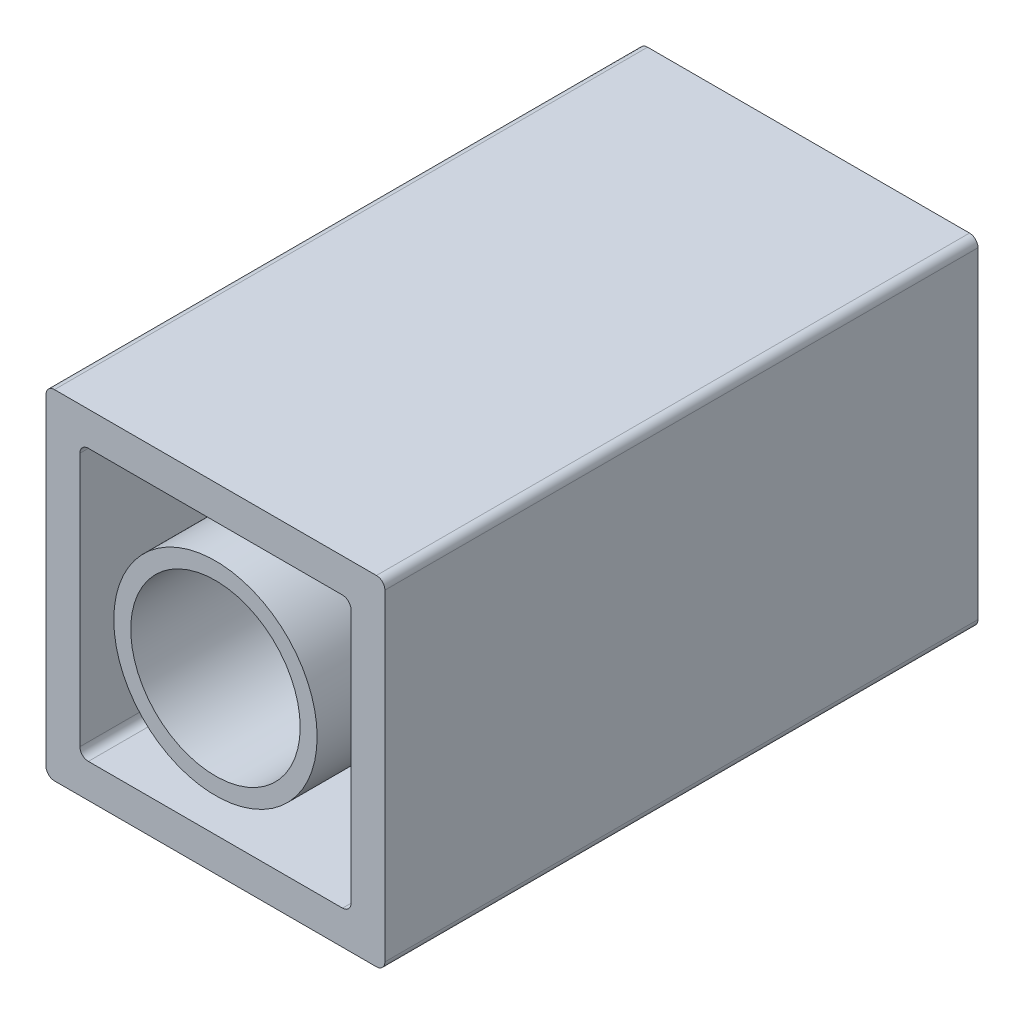
ISO-10303-21;
HEADER;
FILE_DESCRIPTION(('STEP AP214'),'2;1');
FILE_NAME('part.step','',(''),(''),'','','');
FILE_SCHEMA(('AUTOMOTIVE_DESIGN { 1 0 10303 214 1 1 1 1 }'));
ENDSEC;
DATA;
#1=APPLICATION_CONTEXT('core data for automotive mechanical design processes');
#2=APPLICATION_PROTOCOL_DEFINITION('international standard','automotive_design',2000,#1);
#3=PRODUCT_CONTEXT('',#1,'mechanical');
#4=PRODUCT('Part','Part','',(#3));
#5=PRODUCT_RELATED_PRODUCT_CATEGORY('part','',(#4));
#6=PRODUCT_DEFINITION_FORMATION('','',#4);
#7=PRODUCT_DEFINITION_CONTEXT('part definition',#1,'design');
#8=PRODUCT_DEFINITION('design','',#6,#7);
#9=PRODUCT_DEFINITION_SHAPE('','',#8);
#10=(LENGTH_UNIT() NAMED_UNIT(*) SI_UNIT(.MILLI.,.METRE.));
#11=(NAMED_UNIT(*) PLANE_ANGLE_UNIT() SI_UNIT($,.RADIAN.));
#12=(NAMED_UNIT(*) SI_UNIT($,.STERADIAN.) SOLID_ANGLE_UNIT());
#13=UNCERTAINTY_MEASURE_WITH_UNIT(LENGTH_MEASURE(1.E-05),#10,'distance_accuracy_value','');
#14=(GEOMETRIC_REPRESENTATION_CONTEXT(3) GLOBAL_UNCERTAINTY_ASSIGNED_CONTEXT((#13)) GLOBAL_UNIT_ASSIGNED_CONTEXT((#10,
#11,#12)) REPRESENTATION_CONTEXT('',''));
#15=CARTESIAN_POINT('',(0.,0.,0.));
#16=DIRECTION('',(0.,0.,1.));
#17=DIRECTION('',(1.,0.,0.));
#18=AXIS2_PLACEMENT_3D('',#15,#16,#17);
#19=CARTESIAN_POINT('',(-10.,10.,35.));
#20=DIRECTION('',(1.,0.,0.));
#21=DIRECTION('',(0.,1.,0.));
#22=AXIS2_PLACEMENT_3D('',#19,#20,#21);
#23=PLANE('',#22);
#24=DIRECTION('',(0.,-1.,0.));
#25=VECTOR('',#24,1.);
#26=CARTESIAN_POINT('',(-10.,10.,0.));
#27=LINE('',#26,#25);
#28=CARTESIAN_POINT('',(-10.,9.5,0.));
#29=VERTEX_POINT('',#28);
#30=CARTESIAN_POINT('',(-10.,-9.5,0.));
#31=VERTEX_POINT('',#30);
#32=EDGE_CURVE('E324',#29,#31,#27,.T.);
#33=ORIENTED_EDGE('',*,*,#32,.T.);
#34=DIRECTION('',(0.,0.,-1.));
#35=VECTOR('',#34,1.);
#36=CARTESIAN_POINT('',(-10.,-9.5,35.));
#37=LINE('',#36,#35);
#38=CARTESIAN_POINT('',(-10.,-9.5,35.));
#39=VERTEX_POINT('',#38);
#40=EDGE_CURVE('E220',#31,#39,#37,.F.);
#41=ORIENTED_EDGE('',*,*,#40,.T.);
#42=DIRECTION('',(0.,-1.,0.));
#43=VECTOR('',#42,1.);
#44=CARTESIAN_POINT('',(-10.,10.,35.));
#45=LINE('',#44,#43);
#46=CARTESIAN_POINT('',(-10.,9.5,35.));
#47=VERTEX_POINT('',#46);
#48=EDGE_CURVE('E316',#47,#39,#45,.T.);
#49=ORIENTED_EDGE('',*,*,#48,.F.);
#50=DIRECTION('',(0.,0.,-1.));
#51=VECTOR('',#50,1.);
#52=CARTESIAN_POINT('',(-10.,9.5,35.));
#53=LINE('',#52,#51);
#54=EDGE_CURVE('E217',#47,#29,#53,.T.);
#55=ORIENTED_EDGE('',*,*,#54,.T.);
#56=EDGE_LOOP('',(#33,#41,#49,#55));
#57=FACE_BOUND('',#56,.T.);
#58=ADVANCED_FACE('F36',(#57),#23,.F.);
#59=CARTESIAN_POINT('',(-10.,-10.,35.));
#60=DIRECTION('',(0.,1.,0.));
#61=DIRECTION('',(0.,0.,1.));
#62=AXIS2_PLACEMENT_3D('',#59,#60,#61);
#63=PLANE('',#62);
#64=DIRECTION('',(1.,0.,0.));
#65=VECTOR('',#64,1.);
#66=CARTESIAN_POINT('',(-10.,-10.,35.));
#67=LINE('',#66,#65);
#68=CARTESIAN_POINT('',(-9.5,-10.,35.));
#69=VERTEX_POINT('',#68);
#70=CARTESIAN_POINT('',(9.5,-10.,35.));
#71=VERTEX_POINT('',#70);
#72=EDGE_CURVE('E319',#69,#71,#67,.T.);
#73=ORIENTED_EDGE('',*,*,#72,.F.);
#74=DIRECTION('',(0.,0.,-1.));
#75=VECTOR('',#74,1.);
#76=CARTESIAN_POINT('',(-9.5,-10.,35.));
#77=LINE('',#76,#75);
#78=CARTESIAN_POINT('',(-9.5,-10.,0.));
#79=VERTEX_POINT('',#78);
#80=EDGE_CURVE('E206',#69,#79,#77,.T.);
#81=ORIENTED_EDGE('',*,*,#80,.T.);
#82=DIRECTION('',(1.,0.,0.));
#83=VECTOR('',#82,1.);
#84=CARTESIAN_POINT('',(-10.,-10.,0.));
#85=LINE('',#84,#83);
#86=CARTESIAN_POINT('',(9.5,-10.,0.));
#87=VERTEX_POINT('',#86);
#88=EDGE_CURVE('E321',#79,#87,#85,.T.);
#89=ORIENTED_EDGE('',*,*,#88,.T.);
#90=DIRECTION('',(0.,0.,-1.));
#91=VECTOR('',#90,1.);
#92=CARTESIAN_POINT('',(9.5,-10.,35.));
#93=LINE('',#92,#91);
#94=EDGE_CURVE('E204',#87,#71,#93,.F.);
#95=ORIENTED_EDGE('',*,*,#94,.T.);
#96=EDGE_LOOP('',(#73,#81,#89,#95));
#97=FACE_BOUND('',#96,.T.);
#98=ADVANCED_FACE('F261',(#97),#63,.F.);
#99=CARTESIAN_POINT('',(10.,10.,35.));
#100=DIRECTION('',(-1.,0.,0.));
#101=DIRECTION('',(0.,-1.,0.));
#102=AXIS2_PLACEMENT_3D('',#99,#100,#101);
#103=PLANE('',#102);
#104=DIRECTION('',(0.,1.,0.));
#105=VECTOR('',#104,1.);
#106=CARTESIAN_POINT('',(10.,10.,35.));
#107=LINE('',#106,#105);
#108=CARTESIAN_POINT('',(10.,-9.5,35.));
#109=VERTEX_POINT('',#108);
#110=CARTESIAN_POINT('',(10.,9.5,35.));
#111=VERTEX_POINT('',#110);
#112=EDGE_CURVE('E181',#109,#111,#107,.T.);
#113=ORIENTED_EDGE('',*,*,#112,.F.);
#114=DIRECTION('',(0.,0.,-1.));
#115=VECTOR('',#114,1.);
#116=CARTESIAN_POINT('',(10.,-9.5,35.));
#117=LINE('',#116,#115);
#118=CARTESIAN_POINT('',(10.,-9.5,0.));
#119=VERTEX_POINT('',#118);
#120=EDGE_CURVE('E231',#109,#119,#117,.T.);
#121=ORIENTED_EDGE('',*,*,#120,.T.);
#122=DIRECTION('',(0.,1.,0.));
#123=VECTOR('',#122,1.);
#124=CARTESIAN_POINT('',(10.,10.,0.));
#125=LINE('',#124,#123);
#126=CARTESIAN_POINT('',(10.,9.5,0.));
#127=VERTEX_POINT('',#126);
#128=EDGE_CURVE('E317',#119,#127,#125,.T.);
#129=ORIENTED_EDGE('',*,*,#128,.T.);
#130=DIRECTION('',(0.,0.,-1.));
#131=VECTOR('',#130,1.);
#132=CARTESIAN_POINT('',(10.,9.5,35.));
#133=LINE('',#132,#131);
#134=EDGE_CURVE('E229',#127,#111,#133,.F.);
#135=ORIENTED_EDGE('',*,*,#134,.T.);
#136=EDGE_LOOP('',(#113,#121,#129,#135));
#137=FACE_BOUND('',#136,.T.);
#138=ADVANCED_FACE('F267',(#137),#103,.F.);
#139=CARTESIAN_POINT('',(-10.,10.,35.));
#140=DIRECTION('',(0.,-1.,0.));
#141=DIRECTION('',(0.,0.,-1.));
#142=AXIS2_PLACEMENT_3D('',#139,#140,#141);
#143=PLANE('',#142);
#144=DIRECTION('',(-1.,0.,0.));
#145=VECTOR('',#144,1.);
#146=CARTESIAN_POINT('',(-10.,10.,0.));
#147=LINE('',#146,#145);
#148=CARTESIAN_POINT('',(9.5,10.,0.));
#149=VERTEX_POINT('',#148);
#150=CARTESIAN_POINT('',(-9.5,10.,0.));
#151=VERTEX_POINT('',#150);
#152=EDGE_CURVE('E184',#149,#151,#147,.T.);
#153=ORIENTED_EDGE('',*,*,#152,.T.);
#154=DIRECTION('',(0.,0.,-1.));
#155=VECTOR('',#154,1.);
#156=CARTESIAN_POINT('',(-9.5,10.,35.));
#157=LINE('',#156,#155);
#158=CARTESIAN_POINT('',(-9.5,10.,35.));
#159=VERTEX_POINT('',#158);
#160=EDGE_CURVE('E51',#151,#159,#157,.F.);
#161=ORIENTED_EDGE('',*,*,#160,.T.);
#162=DIRECTION('',(-1.,0.,0.));
#163=VECTOR('',#162,1.);
#164=CARTESIAN_POINT('',(-10.,10.,35.));
#165=LINE('',#164,#163);
#166=CARTESIAN_POINT('',(9.5,10.,35.));
#167=VERTEX_POINT('',#166);
#168=EDGE_CURVE('E177',#167,#159,#165,.T.);
#169=ORIENTED_EDGE('',*,*,#168,.F.);
#170=DIRECTION('',(0.,0.,-1.));
#171=VECTOR('',#170,1.);
#172=CARTESIAN_POINT('',(9.5,10.,35.));
#173=LINE('',#172,#171);
#174=EDGE_CURVE('E234',#167,#149,#173,.T.);
#175=ORIENTED_EDGE('',*,*,#174,.T.);
#176=EDGE_LOOP('',(#153,#161,#169,#175));
#177=FACE_BOUND('',#176,.T.);
#178=ADVANCED_FACE('F309',(#177),#143,.F.);
#179=CARTESIAN_POINT('',(0.,0.,35.));
#180=DIRECTION('',(0.,0.,1.));
#181=DIRECTION('',(1.,0.,0.));
#182=AXIS2_PLACEMENT_3D('',#179,#180,#181);
#183=PLANE('',#182);
#184=DIRECTION('',(0.,-1.,0.));
#185=VECTOR('',#184,1.);
#186=CARTESIAN_POINT('',(-8.,10.,35.));
#187=LINE('',#186,#185);
#188=CARTESIAN_POINT('',(-8.,7.5,35.));
#189=VERTEX_POINT('',#188);
#190=CARTESIAN_POINT('',(-8.,-7.5,35.));
#191=VERTEX_POINT('',#190);
#192=EDGE_CURVE('E339',#189,#191,#187,.T.);
#193=ORIENTED_EDGE('',*,*,#192,.F.);
#194=CARTESIAN_POINT('',(-7.5,7.5,35.));
#195=DIRECTION('',(0.,0.,1.));
#196=DIRECTION('',(1.,0.,0.));
#197=AXIS2_PLACEMENT_3D('',#194,#195,#196);
#198=CIRCLE('',#197,0.5);
#199=CARTESIAN_POINT('',(-7.5,8.,35.));
#200=VERTEX_POINT('',#199);
#201=EDGE_CURVE('E243',#189,#200,#198,.F.);
#202=ORIENTED_EDGE('',*,*,#201,.T.);
#203=DIRECTION('',(-1.,0.,0.));
#204=VECTOR('',#203,1.);
#205=CARTESIAN_POINT('',(-10.,8.,35.));
#206=LINE('',#205,#204);
#207=CARTESIAN_POINT('',(7.5,8.,35.));
#208=VERTEX_POINT('',#207);
#209=EDGE_CURVE('E327',#208,#200,#206,.T.);
#210=ORIENTED_EDGE('',*,*,#209,.F.);
#211=CARTESIAN_POINT('',(7.5,7.5,35.));
#212=DIRECTION('',(0.,0.,1.));
#213=DIRECTION('',(1.,0.,0.));
#214=AXIS2_PLACEMENT_3D('',#211,#212,#213);
#215=CIRCLE('',#214,0.5);
#216=CARTESIAN_POINT('',(8.,7.5,35.));
#217=VERTEX_POINT('',#216);
#218=EDGE_CURVE('E238',#208,#217,#215,.F.);
#219=ORIENTED_EDGE('',*,*,#218,.T.);
#220=DIRECTION('',(0.,1.,0.));
#221=VECTOR('',#220,1.);
#222=CARTESIAN_POINT('',(8.,10.,35.));
#223=LINE('',#222,#221);
#224=CARTESIAN_POINT('',(8.,-7.5,35.));
#225=VERTEX_POINT('',#224);
#226=EDGE_CURVE('E334',#225,#217,#223,.T.);
#227=ORIENTED_EDGE('',*,*,#226,.F.);
#228=CARTESIAN_POINT('',(7.5,-7.5,35.));
#229=DIRECTION('',(0.,0.,1.));
#230=DIRECTION('',(1.,0.,0.));
#231=AXIS2_PLACEMENT_3D('',#228,#229,#230);
#232=CIRCLE('',#231,0.5);
#233=CARTESIAN_POINT('',(7.5,-8.,35.));
#234=VERTEX_POINT('',#233);
#235=EDGE_CURVE('E176',#225,#234,#232,.F.);
#236=ORIENTED_EDGE('',*,*,#235,.T.);
#237=DIRECTION('',(1.,0.,0.));
#238=VECTOR('',#237,1.);
#239=CARTESIAN_POINT('',(-10.,-8.,35.));
#240=LINE('',#239,#238);
#241=CARTESIAN_POINT('',(-7.5,-8.,35.));
#242=VERTEX_POINT('',#241);
#243=EDGE_CURVE('E336',#242,#234,#240,.T.);
#244=ORIENTED_EDGE('',*,*,#243,.F.);
#245=CARTESIAN_POINT('',(-7.5,-7.5,35.));
#246=DIRECTION('',(0.,0.,1.));
#247=DIRECTION('',(1.,0.,0.));
#248=AXIS2_PLACEMENT_3D('',#245,#246,#247);
#249=CIRCLE('',#248,0.5);
#250=EDGE_CURVE('E241',#242,#191,#249,.F.);
#251=ORIENTED_EDGE('',*,*,#250,.T.);
#252=EDGE_LOOP('',(#193,#202,#210,#219,#227,#236,#244,#251));
#253=FACE_BOUND('',#252,.T.);
#254=ORIENTED_EDGE('',*,*,#48,.T.);
#255=CARTESIAN_POINT('',(-9.5,-9.5,35.));
#256=DIRECTION('',(0.,0.,1.));
#257=DIRECTION('',(1.,0.,0.));
#258=AXIS2_PLACEMENT_3D('',#255,#256,#257);
#259=CIRCLE('',#258,0.5);
#260=EDGE_CURVE('E227',#39,#69,#259,.T.);
#261=ORIENTED_EDGE('',*,*,#260,.T.);
#262=ORIENTED_EDGE('',*,*,#72,.T.);
#263=CARTESIAN_POINT('',(9.5,-9.5,35.));
#264=DIRECTION('',(0.,0.,1.));
#265=DIRECTION('',(1.,0.,0.));
#266=AXIS2_PLACEMENT_3D('',#263,#264,#265);
#267=CIRCLE('',#266,0.5);
#268=EDGE_CURVE('E225',#71,#109,#267,.T.);
#269=ORIENTED_EDGE('',*,*,#268,.T.);
#270=ORIENTED_EDGE('',*,*,#112,.T.);
#271=CARTESIAN_POINT('',(9.5,9.5,35.));
#272=DIRECTION('',(0.,0.,1.));
#273=DIRECTION('',(1.,0.,0.));
#274=AXIS2_PLACEMENT_3D('',#271,#272,#273);
#275=CIRCLE('',#274,0.5);
#276=EDGE_CURVE('E58',#111,#167,#275,.T.);
#277=ORIENTED_EDGE('',*,*,#276,.T.);
#278=ORIENTED_EDGE('',*,*,#168,.T.);
#279=CARTESIAN_POINT('',(-9.5,9.5,35.));
#280=DIRECTION('',(0.,0.,1.));
#281=DIRECTION('',(1.,0.,0.));
#282=AXIS2_PLACEMENT_3D('',#279,#280,#281);
#283=CIRCLE('',#282,0.5);
#284=EDGE_CURVE('E223',#159,#47,#283,.T.);
#285=ORIENTED_EDGE('',*,*,#284,.T.);
#286=EDGE_LOOP('',(#254,#261,#262,#269,#270,#277,#278,#285));
#287=FACE_BOUND('',#286,.T.);
#288=ADVANCED_FACE('F386',(#253,#287),#183,.T.);
#289=CARTESIAN_POINT('',(0.,0.,0.));
#290=DIRECTION('',(0.,0.,1.));
#291=DIRECTION('',(1.,0.,0.));
#292=AXIS2_PLACEMENT_3D('',#289,#290,#291);
#293=PLANE('',#292);
#294=ORIENTED_EDGE('',*,*,#88,.F.);
#295=CARTESIAN_POINT('',(-9.5,-9.5,0.));
#296=DIRECTION('',(0.,0.,1.));
#297=DIRECTION('',(1.,0.,0.));
#298=AXIS2_PLACEMENT_3D('',#295,#296,#297);
#299=CIRCLE('',#298,0.5);
#300=EDGE_CURVE('E215',#79,#31,#299,.F.);
#301=ORIENTED_EDGE('',*,*,#300,.T.);
#302=ORIENTED_EDGE('',*,*,#32,.F.);
#303=CARTESIAN_POINT('',(-9.5,9.5,0.));
#304=DIRECTION('',(0.,0.,1.));
#305=DIRECTION('',(1.,0.,0.));
#306=AXIS2_PLACEMENT_3D('',#303,#304,#305);
#307=CIRCLE('',#306,0.5);
#308=EDGE_CURVE('E211',#29,#151,#307,.F.);
#309=ORIENTED_EDGE('',*,*,#308,.T.);
#310=ORIENTED_EDGE('',*,*,#152,.F.);
#311=CARTESIAN_POINT('',(9.5,9.5,0.));
#312=DIRECTION('',(0.,0.,1.));
#313=DIRECTION('',(1.,0.,0.));
#314=AXIS2_PLACEMENT_3D('',#311,#312,#313);
#315=CIRCLE('',#314,0.5);
#316=EDGE_CURVE('E209',#149,#127,#315,.F.);
#317=ORIENTED_EDGE('',*,*,#316,.T.);
#318=ORIENTED_EDGE('',*,*,#128,.F.);
#319=CARTESIAN_POINT('',(9.5,-9.5,0.));
#320=DIRECTION('',(0.,0.,1.));
#321=DIRECTION('',(1.,0.,0.));
#322=AXIS2_PLACEMENT_3D('',#319,#320,#321);
#323=CIRCLE('',#322,0.5);
#324=EDGE_CURVE('E213',#119,#87,#323,.F.);
#325=ORIENTED_EDGE('',*,*,#324,.T.);
#326=EDGE_LOOP('',(#294,#301,#302,#309,#310,#317,#318,#325));
#327=FACE_BOUND('',#326,.T.);
#328=ADVANCED_FACE('F312',(#327),#293,.F.);
#329=CARTESIAN_POINT('',(-8.,10.,35.));
#330=DIRECTION('',(1.,0.,0.));
#331=DIRECTION('',(0.,1.,0.));
#332=AXIS2_PLACEMENT_3D('',#329,#330,#331);
#333=PLANE('',#332);
#334=ORIENTED_EDGE('',*,*,#192,.T.);
#335=DIRECTION('',(0.,0.,-1.));
#336=VECTOR('',#335,1.);
#337=CARTESIAN_POINT('',(-8.,-7.5,2.));
#338=LINE('',#337,#336);
#339=CARTESIAN_POINT('',(-8.,-7.5,2.));
#340=VERTEX_POINT('',#339);
#341=EDGE_CURVE('E201',#191,#340,#338,.T.);
#342=ORIENTED_EDGE('',*,*,#341,.T.);
#343=DIRECTION('',(0.,-1.,0.));
#344=VECTOR('',#343,1.);
#345=CARTESIAN_POINT('',(-8.,10.,2.));
#346=LINE('',#345,#344);
#347=CARTESIAN_POINT('',(-8.,7.5,2.));
#348=VERTEX_POINT('',#347);
#349=EDGE_CURVE('E345',#348,#340,#346,.T.);
#350=ORIENTED_EDGE('',*,*,#349,.F.);
#351=DIRECTION('',(0.,0.,-1.));
#352=VECTOR('',#351,1.);
#353=CARTESIAN_POINT('',(-8.,7.5,35.));
#354=LINE('',#353,#352);
#355=EDGE_CURVE('E199',#348,#189,#354,.F.);
#356=ORIENTED_EDGE('',*,*,#355,.T.);
#357=EDGE_LOOP('',(#334,#342,#350,#356));
#358=FACE_BOUND('',#357,.T.);
#359=ADVANCED_FACE('F369',(#358),#333,.T.);
#360=CARTESIAN_POINT('',(-10.,-8.,35.));
#361=DIRECTION('',(0.,1.,0.));
#362=DIRECTION('',(0.,0.,1.));
#363=AXIS2_PLACEMENT_3D('',#360,#361,#362);
#364=PLANE('',#363);
#365=ORIENTED_EDGE('',*,*,#243,.T.);
#366=DIRECTION('',(0.,0.,-1.));
#367=VECTOR('',#366,1.);
#368=CARTESIAN_POINT('',(7.5,-8.,2.));
#369=LINE('',#368,#367);
#370=CARTESIAN_POINT('',(7.5,-8.,2.));
#371=VERTEX_POINT('',#370);
#372=EDGE_CURVE('E197',#234,#371,#369,.T.);
#373=ORIENTED_EDGE('',*,*,#372,.T.);
#374=DIRECTION('',(1.,0.,0.));
#375=VECTOR('',#374,1.);
#376=CARTESIAN_POINT('',(-10.,-8.,2.));
#377=LINE('',#376,#375);
#378=CARTESIAN_POINT('',(-7.5,-8.,2.));
#379=VERTEX_POINT('',#378);
#380=EDGE_CURVE('E156',#379,#371,#377,.T.);
#381=ORIENTED_EDGE('',*,*,#380,.F.);
#382=DIRECTION('',(0.,0.,-1.));
#383=VECTOR('',#382,1.);
#384=CARTESIAN_POINT('',(-7.5,-8.,35.));
#385=LINE('',#384,#383);
#386=EDGE_CURVE('E195',#379,#242,#385,.F.);
#387=ORIENTED_EDGE('',*,*,#386,.T.);
#388=EDGE_LOOP('',(#365,#373,#381,#387));
#389=FACE_BOUND('',#388,.T.);
#390=ADVANCED_FACE('F372',(#389),#364,.T.);
#391=CARTESIAN_POINT('',(8.,10.,35.));
#392=DIRECTION('',(-1.,0.,0.));
#393=DIRECTION('',(0.,-1.,0.));
#394=AXIS2_PLACEMENT_3D('',#391,#392,#393);
#395=PLANE('',#394);
#396=ORIENTED_EDGE('',*,*,#226,.T.);
#397=DIRECTION('',(0.,0.,-1.));
#398=VECTOR('',#397,1.);
#399=CARTESIAN_POINT('',(8.,7.5,2.));
#400=LINE('',#399,#398);
#401=CARTESIAN_POINT('',(8.,7.5,2.));
#402=VERTEX_POINT('',#401);
#403=EDGE_CURVE('E171',#217,#402,#400,.T.);
#404=ORIENTED_EDGE('',*,*,#403,.T.);
#405=DIRECTION('',(0.,1.,0.));
#406=VECTOR('',#405,1.);
#407=CARTESIAN_POINT('',(8.,10.,2.));
#408=LINE('',#407,#406);
#409=CARTESIAN_POINT('',(8.,-7.5,2.));
#410=VERTEX_POINT('',#409);
#411=EDGE_CURVE('E154',#410,#402,#408,.T.);
#412=ORIENTED_EDGE('',*,*,#411,.F.);
#413=DIRECTION('',(0.,0.,-1.));
#414=VECTOR('',#413,1.);
#415=CARTESIAN_POINT('',(8.,-7.5,35.));
#416=LINE('',#415,#414);
#417=EDGE_CURVE('E168',#410,#225,#416,.F.);
#418=ORIENTED_EDGE('',*,*,#417,.T.);
#419=EDGE_LOOP('',(#396,#404,#412,#418));
#420=FACE_BOUND('',#419,.T.);
#421=ADVANCED_FACE('F167',(#420),#395,.T.);
#422=CARTESIAN_POINT('',(-10.,8.,35.));
#423=DIRECTION('',(0.,-1.,0.));
#424=DIRECTION('',(0.,0.,-1.));
#425=AXIS2_PLACEMENT_3D('',#422,#423,#424);
#426=PLANE('',#425);
#427=DIRECTION('',(-1.,0.,0.));
#428=VECTOR('',#427,1.);
#429=CARTESIAN_POINT('',(-10.,8.,2.));
#430=LINE('',#429,#428);
#431=CARTESIAN_POINT('',(7.5,8.,2.));
#432=VERTEX_POINT('',#431);
#433=CARTESIAN_POINT('',(-7.5,8.,2.));
#434=VERTEX_POINT('',#433);
#435=EDGE_CURVE('E172',#432,#434,#430,.T.);
#436=ORIENTED_EDGE('',*,*,#435,.F.);
#437=DIRECTION('',(0.,0.,-1.));
#438=VECTOR('',#437,1.);
#439=CARTESIAN_POINT('',(7.5,8.,35.));
#440=LINE('',#439,#438);
#441=EDGE_CURVE('E193',#432,#208,#440,.F.);
#442=ORIENTED_EDGE('',*,*,#441,.T.);
#443=ORIENTED_EDGE('',*,*,#209,.T.);
#444=DIRECTION('',(0.,0.,-1.));
#445=VECTOR('',#444,1.);
#446=CARTESIAN_POINT('',(-7.5,8.,2.));
#447=LINE('',#446,#445);
#448=EDGE_CURVE('E190',#200,#434,#447,.T.);
#449=ORIENTED_EDGE('',*,*,#448,.T.);
#450=EDGE_LOOP('',(#436,#442,#443,#449));
#451=FACE_BOUND('',#450,.T.);
#452=ADVANCED_FACE('F379',(#451),#426,.T.);
#453=CARTESIAN_POINT('',(0.,0.,2.));
#454=DIRECTION('',(0.,0.,1.));
#455=DIRECTION('',(1.,0.,0.));
#456=AXIS2_PLACEMENT_3D('',#453,#454,#455);
#457=PLANE('',#456);
#458=CARTESIAN_POINT('',(0.,0.,2.));
#459=DIRECTION('',(0.,0.,1.));
#460=DIRECTION('',(1.,0.,0.));
#461=AXIS2_PLACEMENT_3D('',#458,#459,#460);
#462=CIRCLE('',#461,6.8);
#463=CARTESIAN_POINT('',(6.8,0.,2.));
#464=VERTEX_POINT('',#463);
#465=EDGE_CURVE('E11',#464,#464,#462,.F.);
#466=ORIENTED_EDGE('',*,*,#465,.T.);
#467=EDGE_LOOP('',(#466));
#468=FACE_BOUND('',#467,.T.);
#469=ORIENTED_EDGE('',*,*,#411,.T.);
#470=CARTESIAN_POINT('',(7.5,7.5,2.));
#471=DIRECTION('',(0.,0.,1.));
#472=DIRECTION('',(1.,0.,0.));
#473=AXIS2_PLACEMENT_3D('',#470,#471,#472);
#474=CIRCLE('',#473,0.5);
#475=EDGE_CURVE('E161',#402,#432,#474,.T.);
#476=ORIENTED_EDGE('',*,*,#475,.T.);
#477=ORIENTED_EDGE('',*,*,#435,.T.);
#478=CARTESIAN_POINT('',(-7.5,7.5,2.));
#479=DIRECTION('',(0.,0.,1.));
#480=DIRECTION('',(1.,0.,0.));
#481=AXIS2_PLACEMENT_3D('',#478,#479,#480);
#482=CIRCLE('',#481,0.5);
#483=EDGE_CURVE('E179',#434,#348,#482,.T.);
#484=ORIENTED_EDGE('',*,*,#483,.T.);
#485=ORIENTED_EDGE('',*,*,#349,.T.);
#486=CARTESIAN_POINT('',(-7.5,-7.5,2.));
#487=DIRECTION('',(0.,0.,1.));
#488=DIRECTION('',(1.,0.,0.));
#489=AXIS2_PLACEMENT_3D('',#486,#487,#488);
#490=CIRCLE('',#489,0.5);
#491=EDGE_CURVE('E162',#340,#379,#490,.T.);
#492=ORIENTED_EDGE('',*,*,#491,.T.);
#493=ORIENTED_EDGE('',*,*,#380,.T.);
#494=CARTESIAN_POINT('',(7.5,-7.5,2.));
#495=DIRECTION('',(0.,0.,1.));
#496=DIRECTION('',(1.,0.,0.));
#497=AXIS2_PLACEMENT_3D('',#494,#495,#496);
#498=CIRCLE('',#497,0.5);
#499=EDGE_CURVE('E151',#371,#410,#498,.T.);
#500=ORIENTED_EDGE('',*,*,#499,.T.);
#501=EDGE_LOOP('',(#469,#476,#477,#484,#485,#492,#493,#500));
#502=FACE_BOUND('',#501,.T.);
#503=ADVANCED_FACE('F153',(#468,#502),#457,.T.);
#504=CARTESIAN_POINT('',(7.5,7.5,35.));
#505=DIRECTION('',(0.,0.,1.));
#506=DIRECTION('',(1.,0.,0.));
#507=AXIS2_PLACEMENT_3D('',#504,#505,#506);
#508=CYLINDRICAL_SURFACE('',#507,0.5);
#509=ORIENTED_EDGE('',*,*,#218,.F.);
#510=ORIENTED_EDGE('',*,*,#441,.F.);
#511=ORIENTED_EDGE('',*,*,#475,.F.);
#512=ORIENTED_EDGE('',*,*,#403,.F.);
#513=EDGE_LOOP('',(#509,#510,#511,#512));
#514=FACE_BOUND('',#513,.T.);
#515=ADVANCED_FACE('F273',(#514),#508,.F.);
#516=CARTESIAN_POINT('',(7.5,-7.5,35.));
#517=DIRECTION('',(0.,0.,1.));
#518=DIRECTION('',(1.,0.,0.));
#519=AXIS2_PLACEMENT_3D('',#516,#517,#518);
#520=CYLINDRICAL_SURFACE('',#519,0.5);
#521=ORIENTED_EDGE('',*,*,#235,.F.);
#522=ORIENTED_EDGE('',*,*,#417,.F.);
#523=ORIENTED_EDGE('',*,*,#499,.F.);
#524=ORIENTED_EDGE('',*,*,#372,.F.);
#525=EDGE_LOOP('',(#521,#522,#523,#524));
#526=FACE_BOUND('',#525,.T.);
#527=ADVANCED_FACE('F175',(#526),#520,.F.);
#528=CARTESIAN_POINT('',(-7.5,-7.5,35.));
#529=DIRECTION('',(0.,0.,1.));
#530=DIRECTION('',(1.,0.,0.));
#531=AXIS2_PLACEMENT_3D('',#528,#529,#530);
#532=CYLINDRICAL_SURFACE('',#531,0.5);
#533=ORIENTED_EDGE('',*,*,#250,.F.);
#534=ORIENTED_EDGE('',*,*,#386,.F.);
#535=ORIENTED_EDGE('',*,*,#491,.F.);
#536=ORIENTED_EDGE('',*,*,#341,.F.);
#537=EDGE_LOOP('',(#533,#534,#535,#536));
#538=FACE_BOUND('',#537,.T.);
#539=ADVANCED_FACE('F279',(#538),#532,.F.);
#540=CARTESIAN_POINT('',(-7.5,7.5,35.));
#541=DIRECTION('',(0.,0.,1.));
#542=DIRECTION('',(1.,0.,0.));
#543=AXIS2_PLACEMENT_3D('',#540,#541,#542);
#544=CYLINDRICAL_SURFACE('',#543,0.5);
#545=ORIENTED_EDGE('',*,*,#201,.F.);
#546=ORIENTED_EDGE('',*,*,#355,.F.);
#547=ORIENTED_EDGE('',*,*,#483,.F.);
#548=ORIENTED_EDGE('',*,*,#448,.F.);
#549=EDGE_LOOP('',(#545,#546,#547,#548));
#550=FACE_BOUND('',#549,.T.);
#551=ADVANCED_FACE('F282',(#550),#544,.F.);
#552=CARTESIAN_POINT('',(-9.5,-9.5,35.));
#553=DIRECTION('',(0.,0.,-1.));
#554=DIRECTION('',(-1.,0.,0.));
#555=AXIS2_PLACEMENT_3D('',#552,#553,#554);
#556=CYLINDRICAL_SURFACE('',#555,0.5);
#557=ORIENTED_EDGE('',*,*,#260,.F.);
#558=ORIENTED_EDGE('',*,*,#40,.F.);
#559=ORIENTED_EDGE('',*,*,#300,.F.);
#560=ORIENTED_EDGE('',*,*,#80,.F.);
#561=EDGE_LOOP('',(#557,#558,#559,#560));
#562=FACE_BOUND('',#561,.T.);
#563=ADVANCED_FACE('F286',(#562),#556,.T.);
#564=CARTESIAN_POINT('',(9.5,-9.5,35.));
#565=DIRECTION('',(0.,0.,-1.));
#566=DIRECTION('',(-1.,0.,0.));
#567=AXIS2_PLACEMENT_3D('',#564,#565,#566);
#568=CYLINDRICAL_SURFACE('',#567,0.5);
#569=ORIENTED_EDGE('',*,*,#268,.F.);
#570=ORIENTED_EDGE('',*,*,#94,.F.);
#571=ORIENTED_EDGE('',*,*,#324,.F.);
#572=ORIENTED_EDGE('',*,*,#120,.F.);
#573=EDGE_LOOP('',(#569,#570,#571,#572));
#574=FACE_BOUND('',#573,.T.);
#575=ADVANCED_FACE('F290',(#574),#568,.T.);
#576=CARTESIAN_POINT('',(-9.5,9.5,35.));
#577=DIRECTION('',(0.,0.,-1.));
#578=DIRECTION('',(-1.,0.,0.));
#579=AXIS2_PLACEMENT_3D('',#576,#577,#578);
#580=CYLINDRICAL_SURFACE('',#579,0.5);
#581=ORIENTED_EDGE('',*,*,#284,.F.);
#582=ORIENTED_EDGE('',*,*,#160,.F.);
#583=ORIENTED_EDGE('',*,*,#308,.F.);
#584=ORIENTED_EDGE('',*,*,#54,.F.);
#585=EDGE_LOOP('',(#581,#582,#583,#584));
#586=FACE_BOUND('',#585,.T.);
#587=ADVANCED_FACE('F294',(#586),#580,.T.);
#588=CARTESIAN_POINT('',(9.5,9.5,35.));
#589=DIRECTION('',(0.,0.,-1.));
#590=DIRECTION('',(-1.,0.,0.));
#591=AXIS2_PLACEMENT_3D('',#588,#589,#590);
#592=CYLINDRICAL_SURFACE('',#591,0.5);
#593=ORIENTED_EDGE('',*,*,#276,.F.);
#594=ORIENTED_EDGE('',*,*,#134,.F.);
#595=ORIENTED_EDGE('',*,*,#316,.F.);
#596=ORIENTED_EDGE('',*,*,#174,.F.);
#597=EDGE_LOOP('',(#593,#594,#595,#596));
#598=FACE_BOUND('',#597,.T.);
#599=ADVANCED_FACE('F297',(#598),#592,.T.);
#600=CARTESIAN_POINT('',(0.,0.,51.9705627484771));
#601=DIRECTION('',(0.,0.,-1.));
#602=DIRECTION('',(-1.,0.,0.));
#603=AXIS2_PLACEMENT_3D('',#600,#601,#602);
#604=CYLINDRICAL_SURFACE('',#603,6.);
#605=CARTESIAN_POINT('',(0.,0.,2.8));
#606=DIRECTION('',(0.,0.,1.));
#607=DIRECTION('',(1.,0.,0.));
#608=AXIS2_PLACEMENT_3D('',#605,#606,#607);
#609=CIRCLE('',#608,6.);
#610=CARTESIAN_POINT('',(-6.,0.,2.79999999999999));
#611=VERTEX_POINT('',#610);
#612=EDGE_CURVE('E44',#611,#611,#609,.T.);
#613=CARTESIAN_POINT('',(0.,0.,35.));
#614=DIRECTION('',(0.,0.,1.));
#615=DIRECTION('',(1.,0.,0.));
#616=AXIS2_PLACEMENT_3D('',#613,#614,#615);
#617=CIRCLE('',#616,6.);
#618=CARTESIAN_POINT('',(-6.,0.,35.));
#619=VERTEX_POINT('',#618);
#620=EDGE_CURVE('E348',#619,#619,#617,.T.);
#621=CARTESIAN_POINT('',(-6.,0.,2.79999999999999));
#622=CARTESIAN_POINT('',(-6.,0.,3.13541666666666));
#623=CARTESIAN_POINT('',(-6.,0.,3.47083333333332));
#624=CARTESIAN_POINT('',(-6.,0.,4.14166666666666));
#625=CARTESIAN_POINT('',(-6.,0.,4.47708333333332));
#626=CARTESIAN_POINT('',(-6.,0.,5.14791666666666));
#627=CARTESIAN_POINT('',(-6.,0.,5.48333333333332));
#628=CARTESIAN_POINT('',(-6.,0.,6.15416666666666));
#629=CARTESIAN_POINT('',(-6.,0.,6.48958333333332));
#630=CARTESIAN_POINT('',(-6.,0.,7.16041666666666));
#631=CARTESIAN_POINT('',(-6.,0.,7.49583333333332));
#632=CARTESIAN_POINT('',(-6.,0.,8.16666666666666));
#633=CARTESIAN_POINT('',(-6.,0.,8.50208333333332));
#634=CARTESIAN_POINT('',(-6.,0.,9.17291666666666));
#635=CARTESIAN_POINT('',(-6.,0.,9.50833333333333));
#636=CARTESIAN_POINT('',(-6.,0.,10.1791666666667));
#637=CARTESIAN_POINT('',(-6.,0.,10.5145833333333));
#638=CARTESIAN_POINT('',(-6.,0.,11.1854166666667));
#639=CARTESIAN_POINT('',(-6.,0.,11.5208333333333));
#640=CARTESIAN_POINT('',(-6.,0.,12.1916666666667));
#641=CARTESIAN_POINT('',(-6.,0.,12.5270833333333));
#642=CARTESIAN_POINT('',(-6.,0.,13.1979166666667));
#643=CARTESIAN_POINT('',(-6.,0.,13.5333333333333));
#644=CARTESIAN_POINT('',(-6.,0.,14.2041666666667));
#645=CARTESIAN_POINT('',(-6.,0.,14.5395833333333));
#646=CARTESIAN_POINT('',(-6.,0.,15.2104166666667));
#647=CARTESIAN_POINT('',(-6.,0.,15.5458333333333));
#648=CARTESIAN_POINT('',(-6.,0.,16.2166666666667));
#649=CARTESIAN_POINT('',(-6.,0.,16.5520833333333));
#650=CARTESIAN_POINT('',(-6.,0.,17.2229166666667));
#651=CARTESIAN_POINT('',(-6.,0.,17.5583333333333));
#652=CARTESIAN_POINT('',(-6.,0.,18.2291666666667));
#653=CARTESIAN_POINT('',(-6.,0.,18.5645833333333));
#654=CARTESIAN_POINT('',(-6.,0.,19.2354166666667));
#655=CARTESIAN_POINT('',(-6.,0.,19.5708333333333));
#656=CARTESIAN_POINT('',(-6.,0.,20.2416666666667));
#657=CARTESIAN_POINT('',(-6.,0.,20.5770833333333));
#658=CARTESIAN_POINT('',(-6.,0.,21.2479166666667));
#659=CARTESIAN_POINT('',(-6.,0.,21.5833333333333));
#660=CARTESIAN_POINT('',(-6.,0.,22.2541666666667));
#661=CARTESIAN_POINT('',(-6.,0.,22.5895833333333));
#662=CARTESIAN_POINT('',(-6.,0.,23.2604166666667));
#663=CARTESIAN_POINT('',(-6.,0.,23.5958333333333));
#664=CARTESIAN_POINT('',(-6.,0.,24.2666666666667));
#665=CARTESIAN_POINT('',(-6.,0.,24.6020833333333));
#666=CARTESIAN_POINT('',(-6.,0.,25.2729166666667));
#667=CARTESIAN_POINT('',(-6.,0.,25.6083333333333));
#668=CARTESIAN_POINT('',(-6.,0.,26.2791666666667));
#669=CARTESIAN_POINT('',(-6.,0.,26.6145833333333));
#670=CARTESIAN_POINT('',(-6.,0.,27.2854166666667));
#671=CARTESIAN_POINT('',(-6.,0.,27.6208333333333));
#672=CARTESIAN_POINT('',(-6.,0.,28.2916666666667));
#673=CARTESIAN_POINT('',(-6.,0.,28.6270833333333));
#674=CARTESIAN_POINT('',(-6.,0.,29.2979166666667));
#675=CARTESIAN_POINT('',(-6.,0.,29.6333333333333));
#676=CARTESIAN_POINT('',(-6.,0.,30.3041666666667));
#677=CARTESIAN_POINT('',(-6.,0.,30.6395833333333));
#678=CARTESIAN_POINT('',(-6.,0.,31.3104166666667));
#679=CARTESIAN_POINT('',(-6.,0.,31.6458333333333));
#680=CARTESIAN_POINT('',(-6.,0.,32.3166666666667));
#681=CARTESIAN_POINT('',(-6.,0.,32.6520833333333));
#682=CARTESIAN_POINT('',(-6.,0.,33.3229166666667));
#683=CARTESIAN_POINT('',(-6.,0.,33.6583333333333));
#684=CARTESIAN_POINT('',(-6.,0.,34.3291666666667));
#685=CARTESIAN_POINT('',(-6.,0.,34.6645833333333));
#686=CARTESIAN_POINT('',(-6.,0.,35.));
#687=B_SPLINE_CURVE_WITH_KNOTS('',3,(#621,#622,#623,#624,#625,#626,#627,#628,#629,#630,#631,
#632,#633,#634,#635,#636,#637,#638,#639,#640,#641,#642,#643,#644,#645,#646,#647,#648,#649,#650,
#651,#652,#653,#654,#655,#656,#657,#658,#659,#660,#661,#662,#663,#664,#665,#666,#667,#668,#669,
#670,#671,#672,#673,#674,#675,#676,#677,#678,#679,#680,#681,#682,#683,#684,#685,#686),
.UNSPECIFIED.,.F.,.F.,(4,2,2,2,2,2,2,2,2,2,2,2,2,2,2,2,2,2,2,2,2,2,2,2,2,2,2,2,2,2,2,2,4),(0.,
1.00625,2.0125,3.01875,4.025,5.03125,6.0375,7.04375,8.05,9.05625,10.0625,11.06875,12.075,
13.08125,14.0875,15.09375,16.1,17.10625,18.1125,19.11875,20.125,21.13125,22.1375,23.14375,24.15,
25.15625,26.1625,27.16875,28.175,29.18125,30.1875,31.19375,32.2),.UNSPECIFIED.);
#688=EDGE_CURVE('BSEAM247',#611,#619,#687,.T.);
#689=ORIENTED_EDGE('',*,*,#612,.T.);
#690=ORIENTED_EDGE('',*,*,#620,.F.);
#691=ORIENTED_EDGE('',*,*,#688,.T.);
#692=ORIENTED_EDGE('',*,*,#688,.F.);
#693=EDGE_LOOP('',(#689,#691,#690,#692));
#694=FACE_BOUND('',#693,.T.);
#695=ADVANCED_FACE('F247',(#694),#604,.T.);
#696=CARTESIAN_POINT('',(0.,0.,35.));
#697=DIRECTION('',(0.,0.,1.));
#698=DIRECTION('',(1.,0.,0.));
#699=AXIS2_PLACEMENT_3D('',#696,#697,#698);
#700=PLANE('',#699);
#701=CARTESIAN_POINT('',(0.,0.,35.));
#702=DIRECTION('',(0.,0.,1.));
#703=DIRECTION('',(1.,0.,0.));
#704=AXIS2_PLACEMENT_3D('',#701,#702,#703);
#705=CIRCLE('',#704,5.);
#706=CARTESIAN_POINT('',(5.,0.,35.));
#707=VERTEX_POINT('',#706);
#708=EDGE_CURVE('E354',#707,#707,#705,.T.);
#709=ORIENTED_EDGE('',*,*,#708,.F.);
#710=EDGE_LOOP('',(#709));
#711=FACE_BOUND('',#710,.T.);
#712=ORIENTED_EDGE('',*,*,#620,.T.);
#713=EDGE_LOOP('',(#712));
#714=FACE_BOUND('',#713,.T.);
#715=ADVANCED_FACE('F304',(#711,#714),#700,.T.);
#716=CARTESIAN_POINT('',(0.,0.,-12.142135623731));
#717=DIRECTION('',(0.,0.,1.));
#718=DIRECTION('',(1.,0.,0.));
#719=AXIS2_PLACEMENT_3D('',#716,#717,#718);
#720=CYLINDRICAL_SURFACE('',#719,5.);
#721=CARTESIAN_POINT('',(0.,0.,2.));
#722=DIRECTION('',(0.,0.,1.));
#723=DIRECTION('',(1.,0.,0.));
#724=AXIS2_PLACEMENT_3D('',#721,#722,#723);
#725=CIRCLE('',#724,5.);
#726=CARTESIAN_POINT('',(5.,0.,2.));
#727=VERTEX_POINT('',#726);
#728=EDGE_CURVE('E351',#727,#727,#725,.F.);
#729=CARTESIAN_POINT('',(5.,0.,2.));
#730=CARTESIAN_POINT('',(5.,0.,2.34375));
#731=CARTESIAN_POINT('',(5.,0.,2.6875));
#732=CARTESIAN_POINT('',(5.,0.,3.375));
#733=CARTESIAN_POINT('',(5.,0.,3.71875));
#734=CARTESIAN_POINT('',(5.,0.,4.40625));
#735=CARTESIAN_POINT('',(5.,0.,4.75));
#736=CARTESIAN_POINT('',(5.,0.,5.4375));
#737=CARTESIAN_POINT('',(5.,0.,5.78125));
#738=CARTESIAN_POINT('',(5.,0.,6.46875));
#739=CARTESIAN_POINT('',(5.,0.,6.8125));
#740=CARTESIAN_POINT('',(5.,0.,7.5));
#741=CARTESIAN_POINT('',(5.,0.,7.84375));
#742=CARTESIAN_POINT('',(5.,0.,8.53125));
#743=CARTESIAN_POINT('',(5.,0.,8.875));
#744=CARTESIAN_POINT('',(5.,0.,9.5625));
#745=CARTESIAN_POINT('',(5.,0.,9.90625));
#746=CARTESIAN_POINT('',(5.,0.,10.59375));
#747=CARTESIAN_POINT('',(5.,0.,10.9375));
#748=CARTESIAN_POINT('',(5.,0.,11.625));
#749=CARTESIAN_POINT('',(5.,0.,11.96875));
#750=CARTESIAN_POINT('',(5.,0.,12.65625));
#751=CARTESIAN_POINT('',(5.,0.,13.));
#752=CARTESIAN_POINT('',(5.,0.,13.6875));
#753=CARTESIAN_POINT('',(5.,0.,14.03125));
#754=CARTESIAN_POINT('',(5.,0.,14.71875));
#755=CARTESIAN_POINT('',(5.,0.,15.0625));
#756=CARTESIAN_POINT('',(5.,0.,15.75));
#757=CARTESIAN_POINT('',(5.,0.,16.09375));
#758=CARTESIAN_POINT('',(5.,0.,16.78125));
#759=CARTESIAN_POINT('',(5.,0.,17.125));
#760=CARTESIAN_POINT('',(5.,0.,17.8125));
#761=CARTESIAN_POINT('',(5.,0.,18.15625));
#762=CARTESIAN_POINT('',(5.,0.,18.84375));
#763=CARTESIAN_POINT('',(5.,0.,19.1875));
#764=CARTESIAN_POINT('',(5.,0.,19.875));
#765=CARTESIAN_POINT('',(5.,0.,20.21875));
#766=CARTESIAN_POINT('',(5.,0.,20.90625));
#767=CARTESIAN_POINT('',(5.,0.,21.25));
#768=CARTESIAN_POINT('',(5.,0.,21.9375));
#769=CARTESIAN_POINT('',(5.,0.,22.28125));
#770=CARTESIAN_POINT('',(5.,0.,22.96875));
#771=CARTESIAN_POINT('',(5.,0.,23.3125));
#772=CARTESIAN_POINT('',(5.,0.,24.));
#773=CARTESIAN_POINT('',(5.,0.,24.34375));
#774=CARTESIAN_POINT('',(5.,0.,25.03125));
#775=CARTESIAN_POINT('',(5.,0.,25.375));
#776=CARTESIAN_POINT('',(5.,0.,26.0625));
#777=CARTESIAN_POINT('',(5.,0.,26.40625));
#778=CARTESIAN_POINT('',(5.,0.,27.09375));
#779=CARTESIAN_POINT('',(5.,0.,27.4375));
#780=CARTESIAN_POINT('',(5.,0.,28.125));
#781=CARTESIAN_POINT('',(5.,0.,28.46875));
#782=CARTESIAN_POINT('',(5.,0.,29.15625));
#783=CARTESIAN_POINT('',(5.,0.,29.5));
#784=CARTESIAN_POINT('',(5.,0.,30.1875));
#785=CARTESIAN_POINT('',(5.,0.,30.53125));
#786=CARTESIAN_POINT('',(5.,0.,31.21875));
#787=CARTESIAN_POINT('',(5.,0.,31.5625));
#788=CARTESIAN_POINT('',(5.,0.,32.25));
#789=CARTESIAN_POINT('',(5.,0.,32.59375));
#790=CARTESIAN_POINT('',(5.,0.,33.28125));
#791=CARTESIAN_POINT('',(5.,0.,33.625));
#792=CARTESIAN_POINT('',(5.,0.,34.3125));
#793=CARTESIAN_POINT('',(5.,0.,34.65625));
#794=CARTESIAN_POINT('',(5.,0.,35.));
#795=B_SPLINE_CURVE_WITH_KNOTS('',3,(#729,#730,#731,#732,#733,#734,#735,#736,#737,#738,#739,
#740,#741,#742,#743,#744,#745,#746,#747,#748,#749,#750,#751,#752,#753,#754,#755,#756,#757,#758,
#759,#760,#761,#762,#763,#764,#765,#766,#767,#768,#769,#770,#771,#772,#773,#774,#775,#776,#777,
#778,#779,#780,#781,#782,#783,#784,#785,#786,#787,#788,#789,#790,#791,#792,#793,#794),
.UNSPECIFIED.,.F.,.F.,(4,2,2,2,2,2,2,2,2,2,2,2,2,2,2,2,2,2,2,2,2,2,2,2,2,2,2,2,2,2,2,2,4),(0.,
1.03125,2.0625,3.09375,4.125,5.15625,6.1875,7.21875,8.25,9.28125,10.3125,11.34375,12.375,
13.40625,14.4375,15.46875,16.5,17.53125,18.5625,19.59375,20.625,21.65625,22.6875,23.71875,24.75,
25.78125,26.8125,27.84375,28.875,29.90625,30.9375,31.96875,33.),.UNSPECIFIED.);
#796=EDGE_CURVE('BSEAM256',#727,#707,#795,.T.);
#797=ORIENTED_EDGE('',*,*,#728,.T.);
#798=ORIENTED_EDGE('',*,*,#708,.T.);
#799=ORIENTED_EDGE('',*,*,#796,.T.);
#800=ORIENTED_EDGE('',*,*,#796,.F.);
#801=EDGE_LOOP('',(#797,#799,#798,#800));
#802=FACE_BOUND('',#801,.T.);
#803=ADVANCED_FACE('F256',(#802),#720,.F.);
#804=CARTESIAN_POINT('',(0.,0.,2.));
#805=DIRECTION('',(0.,0.,1.));
#806=DIRECTION('',(1.,0.,0.));
#807=AXIS2_PLACEMENT_3D('',#804,#805,#806);
#808=PLANE('',#807);
#809=ORIENTED_EDGE('',*,*,#728,.F.);
#810=EDGE_LOOP('',(#809));
#811=FACE_BOUND('',#810,.T.);
#812=ADVANCED_FACE('F251',(#811),#808,.T.);
#813=CARTESIAN_POINT('',(0.,0.,2.8));
#814=DIRECTION('',(0.,0.,1.));
#815=DIRECTION('',(1.,0.,0.));
#816=AXIS2_PLACEMENT_3D('',#813,#814,#815);
#817=TOROIDAL_SURFACE('',#816,6.8,0.8);
#818=ORIENTED_EDGE('',*,*,#465,.F.);
#819=EDGE_LOOP('',(#818));
#820=FACE_BOUND('',#819,.T.);
#821=ORIENTED_EDGE('',*,*,#612,.F.);
#822=EDGE_LOOP('',(#821));
#823=FACE_BOUND('',#822,.T.);
#824=ADVANCED_FACE('F38',(#820,#823),#817,.F.);
#825=CLOSED_SHELL('',(#58,#98,#138,#178,#288,#328,#359,#390,#421,#452,#503,#515,#527,#539,#551,
#563,#575,#587,#599,#695,#715,#803,#812,#824));
#826=MANIFOLD_SOLID_BREP('B2',#825);
#827=ADVANCED_BREP_SHAPE_REPRESENTATION('',(#18,#826),#14);
#828=SHAPE_DEFINITION_REPRESENTATION(#9,#827);
ENDSEC;
END-ISO-10303-21;
